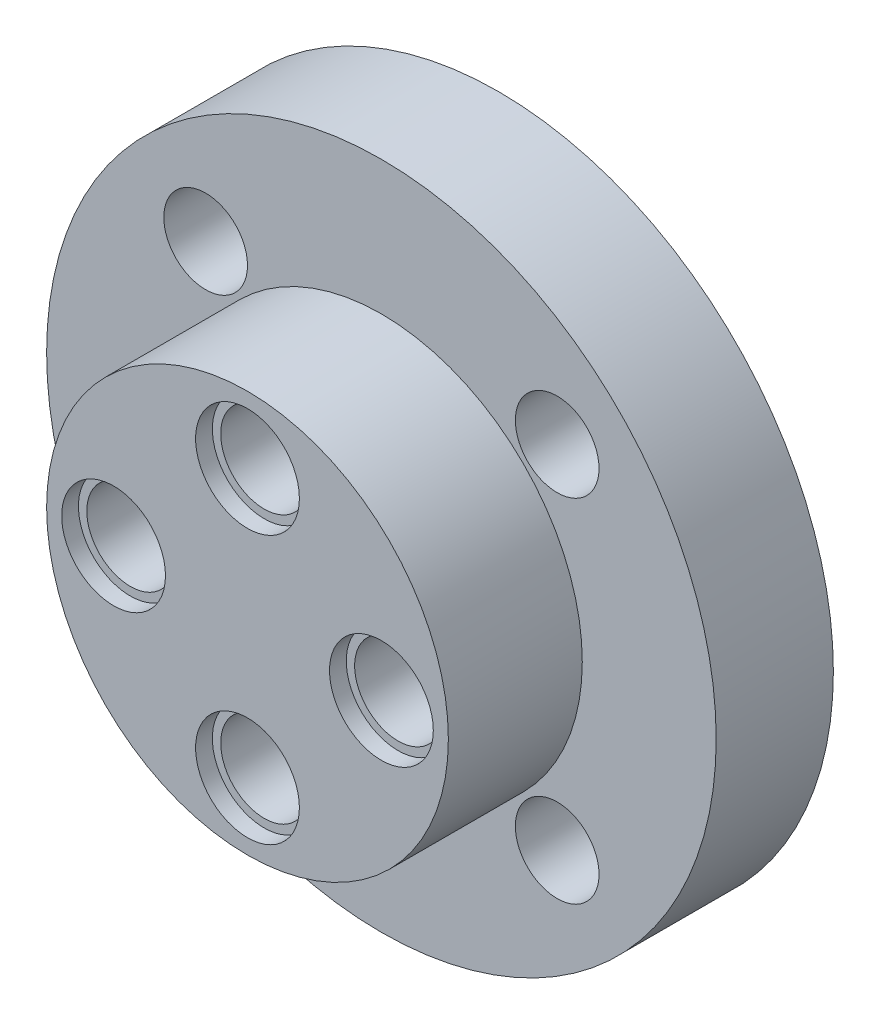
ISO-10303-21;
HEADER;
FILE_DESCRIPTION(('STEP AP214'),'2;1');
FILE_NAME('part.step','',(''),(''),'','','');
FILE_SCHEMA(('AUTOMOTIVE_DESIGN { 1 0 10303 214 1 1 1 1 }'));
ENDSEC;
DATA;
#1=APPLICATION_CONTEXT('core data for automotive mechanical design processes');
#2=APPLICATION_PROTOCOL_DEFINITION('international standard','automotive_design',2000,#1);
#3=PRODUCT_CONTEXT('',#1,'mechanical');
#4=PRODUCT('Part','Part','',(#3));
#5=PRODUCT_RELATED_PRODUCT_CATEGORY('part','',(#4));
#6=PRODUCT_DEFINITION_FORMATION('','',#4);
#7=PRODUCT_DEFINITION_CONTEXT('part definition',#1,'design');
#8=PRODUCT_DEFINITION('design','',#6,#7);
#9=PRODUCT_DEFINITION_SHAPE('','',#8);
#10=(LENGTH_UNIT() NAMED_UNIT(*) SI_UNIT(.MILLI.,.METRE.));
#11=(NAMED_UNIT(*) PLANE_ANGLE_UNIT() SI_UNIT($,.RADIAN.));
#12=(NAMED_UNIT(*) SI_UNIT($,.STERADIAN.) SOLID_ANGLE_UNIT());
#13=UNCERTAINTY_MEASURE_WITH_UNIT(LENGTH_MEASURE(1.E-05),#10,'distance_accuracy_value','');
#14=(GEOMETRIC_REPRESENTATION_CONTEXT(3) GLOBAL_UNCERTAINTY_ASSIGNED_CONTEXT((#13)) GLOBAL_UNIT_ASSIGNED_CONTEXT((#10,
#11,#12)) REPRESENTATION_CONTEXT('',''));
#15=CARTESIAN_POINT('',(0.,0.,0.));
#16=DIRECTION('',(0.,0.,1.));
#17=DIRECTION('',(1.,0.,0.));
#18=AXIS2_PLACEMENT_3D('',#15,#16,#17);
#19=CARTESIAN_POINT('',(0.,0.,7.));
#20=DIRECTION('',(0.,0.,1.));
#21=DIRECTION('',(1.,0.,0.));
#22=AXIS2_PLACEMENT_3D('',#19,#20,#21);
#23=PLANE('',#22);
#24=CARTESIAN_POINT('',(0.,0.,7.));
#25=DIRECTION('',(0.,0.,1.));
#26=DIRECTION('',(1.,0.,0.));
#27=AXIS2_PLACEMENT_3D('',#24,#25,#26);
#28=CIRCLE('',#27,12.);
#29=CARTESIAN_POINT('',(12.,0.,7.));
#30=VERTEX_POINT('',#29);
#31=EDGE_CURVE('E93',#30,#30,#28,.T.);
#32=ORIENTED_EDGE('',*,*,#31,.F.);
#33=EDGE_LOOP('',(#32));
#34=FACE_BOUND('',#33,.T.);
#35=CARTESIAN_POINT('',(-10.5,-10.5,7.));
#36=DIRECTION('',(0.,0.,1.));
#37=DIRECTION('',(1.,0.,0.));
#38=AXIS2_PLACEMENT_3D('',#35,#36,#37);
#39=CIRCLE('',#38,2.5);
#40=CARTESIAN_POINT('',(-8.,-10.5,7.));
#41=VERTEX_POINT('',#40);
#42=EDGE_CURVE('E112',#41,#41,#39,.T.);
#43=ORIENTED_EDGE('',*,*,#42,.F.);
#44=EDGE_LOOP('',(#43));
#45=FACE_BOUND('',#44,.T.);
#46=CARTESIAN_POINT('',(10.5,10.5,7.));
#47=DIRECTION('',(0.,0.,1.));
#48=DIRECTION('',(1.,0.,0.));
#49=AXIS2_PLACEMENT_3D('',#46,#47,#48);
#50=CIRCLE('',#49,2.5);
#51=CARTESIAN_POINT('',(13.,10.5,7.));
#52=VERTEX_POINT('',#51);
#53=EDGE_CURVE('E76',#52,#52,#50,.T.);
#54=ORIENTED_EDGE('',*,*,#53,.F.);
#55=EDGE_LOOP('',(#54));
#56=FACE_BOUND('',#55,.T.);
#57=CARTESIAN_POINT('',(0.,0.,7.));
#58=DIRECTION('',(0.,0.,1.));
#59=DIRECTION('',(1.,0.,0.));
#60=AXIS2_PLACEMENT_3D('',#57,#58,#59);
#61=CIRCLE('',#60,20.);
#62=CARTESIAN_POINT('',(20.,0.,7.));
#63=VERTEX_POINT('',#62);
#64=EDGE_CURVE('E11',#63,#63,#61,.T.);
#65=ORIENTED_EDGE('',*,*,#64,.T.);
#66=EDGE_LOOP('',(#65));
#67=FACE_BOUND('',#66,.T.);
#68=CARTESIAN_POINT('',(10.5,-10.5,7.));
#69=DIRECTION('',(0.,0.,1.));
#70=DIRECTION('',(1.,0.,0.));
#71=AXIS2_PLACEMENT_3D('',#68,#69,#70);
#72=CIRCLE('',#71,2.5);
#73=CARTESIAN_POINT('',(13.,-10.5,7.));
#74=VERTEX_POINT('',#73);
#75=EDGE_CURVE('E118',#74,#74,#72,.T.);
#76=ORIENTED_EDGE('',*,*,#75,.F.);
#77=EDGE_LOOP('',(#76));
#78=FACE_BOUND('',#77,.T.);
#79=CARTESIAN_POINT('',(-10.5,10.5,7.));
#80=DIRECTION('',(0.,0.,1.));
#81=DIRECTION('',(1.,0.,0.));
#82=AXIS2_PLACEMENT_3D('',#79,#80,#81);
#83=CIRCLE('',#82,2.5);
#84=CARTESIAN_POINT('',(-8.,10.5,7.));
#85=VERTEX_POINT('',#84);
#86=EDGE_CURVE('E106',#85,#85,#83,.T.);
#87=ORIENTED_EDGE('',*,*,#86,.F.);
#88=EDGE_LOOP('',(#87));
#89=FACE_BOUND('',#88,.T.);
#90=ADVANCED_FACE('F63',(#34,#45,#56,#67,#78,#89),#23,.T.);
#91=CARTESIAN_POINT('',(0.,0.,0.));
#92=DIRECTION('',(0.,0.,1.));
#93=DIRECTION('',(1.,0.,0.));
#94=AXIS2_PLACEMENT_3D('',#91,#92,#93);
#95=PLANE('',#94);
#96=CARTESIAN_POINT('',(0.,0.,0.));
#97=DIRECTION('',(0.,0.,1.));
#98=DIRECTION('',(1.,0.,0.));
#99=AXIS2_PLACEMENT_3D('',#96,#97,#98);
#100=CIRCLE('',#99,20.);
#101=CARTESIAN_POINT('',(20.,0.,0.));
#102=VERTEX_POINT('',#101);
#103=EDGE_CURVE('E71',#102,#102,#100,.T.);
#104=ORIENTED_EDGE('',*,*,#103,.F.);
#105=EDGE_LOOP('',(#104));
#106=FACE_BOUND('',#105,.T.);
#107=CARTESIAN_POINT('',(10.5,10.5,0.));
#108=DIRECTION('',(0.,0.,1.));
#109=DIRECTION('',(1.,0.,0.));
#110=AXIS2_PLACEMENT_3D('',#107,#108,#109);
#111=CIRCLE('',#110,2.5);
#112=CARTESIAN_POINT('',(13.,10.5,0.));
#113=VERTEX_POINT('',#112);
#114=EDGE_CURVE('E79',#113,#113,#111,.T.);
#115=ORIENTED_EDGE('',*,*,#114,.T.);
#116=EDGE_LOOP('',(#115));
#117=FACE_BOUND('',#116,.T.);
#118=CARTESIAN_POINT('',(10.5,-10.5,0.));
#119=DIRECTION('',(0.,0.,1.));
#120=DIRECTION('',(1.,0.,0.));
#121=AXIS2_PLACEMENT_3D('',#118,#119,#120);
#122=CIRCLE('',#121,2.5);
#123=CARTESIAN_POINT('',(13.,-10.5,0.));
#124=VERTEX_POINT('',#123);
#125=EDGE_CURVE('E115',#124,#124,#122,.T.);
#126=ORIENTED_EDGE('',*,*,#125,.T.);
#127=EDGE_LOOP('',(#126));
#128=FACE_BOUND('',#127,.T.);
#129=CARTESIAN_POINT('',(-10.5,-10.5,0.));
#130=DIRECTION('',(0.,0.,1.));
#131=DIRECTION('',(1.,0.,0.));
#132=AXIS2_PLACEMENT_3D('',#129,#130,#131);
#133=CIRCLE('',#132,2.5);
#134=CARTESIAN_POINT('',(-8.,-10.5,0.));
#135=VERTEX_POINT('',#134);
#136=EDGE_CURVE('E109',#135,#135,#133,.T.);
#137=ORIENTED_EDGE('',*,*,#136,.T.);
#138=EDGE_LOOP('',(#137));
#139=FACE_BOUND('',#138,.T.);
#140=CARTESIAN_POINT('',(-10.5,10.5,0.));
#141=DIRECTION('',(0.,0.,1.));
#142=DIRECTION('',(1.,0.,0.));
#143=AXIS2_PLACEMENT_3D('',#140,#141,#142);
#144=CIRCLE('',#143,2.5);
#145=CARTESIAN_POINT('',(-8.,10.5,0.));
#146=VERTEX_POINT('',#145);
#147=EDGE_CURVE('E102',#146,#146,#144,.T.);
#148=ORIENTED_EDGE('',*,*,#147,.T.);
#149=EDGE_LOOP('',(#148));
#150=FACE_BOUND('',#149,.T.);
#151=ADVANCED_FACE('F128',(#106,#117,#128,#139,#150),#95,.F.);
#152=CARTESIAN_POINT('',(0.,0.,7.));
#153=DIRECTION('',(0.,0.,-1.));
#154=DIRECTION('',(-1.,0.,0.));
#155=AXIS2_PLACEMENT_3D('',#152,#153,#154);
#156=CYLINDRICAL_SURFACE('',#155,20.);
#157=ORIENTED_EDGE('',*,*,#64,.F.);
#158=EDGE_LOOP('',(#157));
#159=FACE_BOUND('',#158,.T.);
#160=ORIENTED_EDGE('',*,*,#103,.T.);
#161=EDGE_LOOP('',(#160));
#162=FACE_BOUND('',#161,.T.);
#163=ADVANCED_FACE('F65',(#159,#162),#156,.T.);
#164=CARTESIAN_POINT('',(10.5,10.5,7.));
#165=DIRECTION('',(0.,0.,-1.));
#166=DIRECTION('',(-1.,0.,0.));
#167=AXIS2_PLACEMENT_3D('',#164,#165,#166);
#168=CYLINDRICAL_SURFACE('',#167,2.5);
#169=ORIENTED_EDGE('',*,*,#53,.T.);
#170=EDGE_LOOP('',(#169));
#171=FACE_BOUND('',#170,.T.);
#172=ORIENTED_EDGE('',*,*,#114,.F.);
#173=EDGE_LOOP('',(#172));
#174=FACE_BOUND('',#173,.T.);
#175=ADVANCED_FACE('F131',(#171,#174),#168,.F.);
#176=CARTESIAN_POINT('',(10.5,-10.5,7.));
#177=DIRECTION('',(0.,0.,-1.));
#178=DIRECTION('',(-1.,0.,0.));
#179=AXIS2_PLACEMENT_3D('',#176,#177,#178);
#180=CYLINDRICAL_SURFACE('',#179,2.5);
#181=ORIENTED_EDGE('',*,*,#75,.T.);
#182=EDGE_LOOP('',(#181));
#183=FACE_BOUND('',#182,.T.);
#184=ORIENTED_EDGE('',*,*,#125,.F.);
#185=EDGE_LOOP('',(#184));
#186=FACE_BOUND('',#185,.T.);
#187=ADVANCED_FACE('F133',(#183,#186),#180,.F.);
#188=CARTESIAN_POINT('',(-10.5,-10.5,7.));
#189=DIRECTION('',(0.,0.,-1.));
#190=DIRECTION('',(-1.,0.,0.));
#191=AXIS2_PLACEMENT_3D('',#188,#189,#190);
#192=CYLINDRICAL_SURFACE('',#191,2.5);
#193=ORIENTED_EDGE('',*,*,#42,.T.);
#194=EDGE_LOOP('',(#193));
#195=FACE_BOUND('',#194,.T.);
#196=ORIENTED_EDGE('',*,*,#136,.F.);
#197=EDGE_LOOP('',(#196));
#198=FACE_BOUND('',#197,.T.);
#199=ADVANCED_FACE('F139',(#195,#198),#192,.F.);
#200=CARTESIAN_POINT('',(-10.5,10.5,7.));
#201=DIRECTION('',(0.,0.,-1.));
#202=DIRECTION('',(-1.,0.,0.));
#203=AXIS2_PLACEMENT_3D('',#200,#201,#202);
#204=CYLINDRICAL_SURFACE('',#203,2.5);
#205=ORIENTED_EDGE('',*,*,#86,.T.);
#206=EDGE_LOOP('',(#205));
#207=FACE_BOUND('',#206,.T.);
#208=ORIENTED_EDGE('',*,*,#147,.F.);
#209=EDGE_LOOP('',(#208));
#210=FACE_BOUND('',#209,.T.);
#211=ADVANCED_FACE('F160',(#207,#210),#204,.F.);
#212=CARTESIAN_POINT('',(0.,0.,15.));
#213=DIRECTION('',(0.,0.,-1.));
#214=DIRECTION('',(-1.,0.,0.));
#215=AXIS2_PLACEMENT_3D('',#212,#213,#214);
#216=CYLINDRICAL_SURFACE('',#215,12.);
#217=CARTESIAN_POINT('',(0.,0.,15.));
#218=DIRECTION('',(0.,0.,1.));
#219=DIRECTION('',(1.,0.,0.));
#220=AXIS2_PLACEMENT_3D('',#217,#218,#219);
#221=CIRCLE('',#220,12.);
#222=CARTESIAN_POINT('',(12.,0.,15.));
#223=VERTEX_POINT('',#222);
#224=EDGE_CURVE('E97',#223,#223,#221,.T.);
#225=ORIENTED_EDGE('',*,*,#224,.F.);
#226=EDGE_LOOP('',(#225));
#227=FACE_BOUND('',#226,.T.);
#228=ORIENTED_EDGE('',*,*,#31,.T.);
#229=EDGE_LOOP('',(#228));
#230=FACE_BOUND('',#229,.T.);
#231=ADVANCED_FACE('F162',(#227,#230),#216,.T.);
#232=CARTESIAN_POINT('',(0.,0.,15.));
#233=DIRECTION('',(0.,0.,1.));
#234=DIRECTION('',(1.,0.,0.));
#235=AXIS2_PLACEMENT_3D('',#232,#233,#234);
#236=PLANE('',#235);
#237=CARTESIAN_POINT('',(-8.,0.,15.));
#238=DIRECTION('',(0.,0.,1.));
#239=DIRECTION('',(1.,0.,0.));
#240=AXIS2_PLACEMENT_3D('',#237,#238,#239);
#241=CIRCLE('',#240,3.1);
#242=CARTESIAN_POINT('',(-4.9,0.,15.));
#243=VERTEX_POINT('',#242);
#244=EDGE_CURVE('E306',#243,#243,#241,.T.);
#245=ORIENTED_EDGE('',*,*,#244,.F.);
#246=EDGE_LOOP('',(#245));
#247=FACE_BOUND('',#246,.T.);
#248=CARTESIAN_POINT('',(0.,8.,15.));
#249=DIRECTION('',(0.,0.,1.));
#250=DIRECTION('',(1.,0.,0.));
#251=AXIS2_PLACEMENT_3D('',#248,#249,#250);
#252=CIRCLE('',#251,3.1);
#253=CARTESIAN_POINT('',(3.1,8.,15.));
#254=VERTEX_POINT('',#253);
#255=EDGE_CURVE('E309',#254,#254,#252,.T.);
#256=ORIENTED_EDGE('',*,*,#255,.F.);
#257=EDGE_LOOP('',(#256));
#258=FACE_BOUND('',#257,.T.);
#259=CARTESIAN_POINT('',(8.,0.,15.));
#260=DIRECTION('',(0.,0.,1.));
#261=DIRECTION('',(1.,0.,0.));
#262=AXIS2_PLACEMENT_3D('',#259,#260,#261);
#263=CIRCLE('',#262,3.1);
#264=CARTESIAN_POINT('',(11.1,0.,15.));
#265=VERTEX_POINT('',#264);
#266=EDGE_CURVE('E315',#265,#265,#263,.T.);
#267=ORIENTED_EDGE('',*,*,#266,.F.);
#268=EDGE_LOOP('',(#267));
#269=FACE_BOUND('',#268,.T.);
#270=CARTESIAN_POINT('',(0.,-8.,15.));
#271=DIRECTION('',(0.,0.,1.));
#272=DIRECTION('',(1.,0.,0.));
#273=AXIS2_PLACEMENT_3D('',#270,#271,#272);
#274=CIRCLE('',#273,3.1);
#275=CARTESIAN_POINT('',(3.1,-8.,15.));
#276=VERTEX_POINT('',#275);
#277=EDGE_CURVE('E321',#276,#276,#274,.T.);
#278=ORIENTED_EDGE('',*,*,#277,.F.);
#279=EDGE_LOOP('',(#278));
#280=FACE_BOUND('',#279,.T.);
#281=ORIENTED_EDGE('',*,*,#224,.T.);
#282=EDGE_LOOP('',(#281));
#283=FACE_BOUND('',#282,.T.);
#284=ADVANCED_FACE('F169',(#247,#258,#269,#280,#283),#236,.T.);
#285=CARTESIAN_POINT('',(-8.,0.,14.));
#286=DIRECTION('',(0.,0.,1.));
#287=DIRECTION('',(1.,0.,0.));
#288=AXIS2_PLACEMENT_3D('',#285,#286,#287);
#289=PLANE('',#288);
#290=CARTESIAN_POINT('',(-8.,0.,14.));
#291=DIRECTION('',(0.,0.,1.));
#292=DIRECTION('',(1.,0.,0.));
#293=AXIS2_PLACEMENT_3D('',#290,#291,#292);
#294=CIRCLE('',#293,3.1);
#295=CARTESIAN_POINT('',(-4.9,0.,14.));
#296=VERTEX_POINT('',#295);
#297=EDGE_CURVE('E86',#296,#296,#294,.T.);
#298=ORIENTED_EDGE('',*,*,#297,.T.);
#299=EDGE_LOOP('',(#298));
#300=FACE_BOUND('',#299,.T.);
#301=CARTESIAN_POINT('',(-8.,0.,14.));
#302=DIRECTION('',(0.,0.,1.));
#303=DIRECTION('',(1.,0.,0.));
#304=AXIS2_PLACEMENT_3D('',#301,#302,#303);
#305=CIRCLE('',#304,2.6);
#306=CARTESIAN_POINT('',(-5.4,0.,14.));
#307=VERTEX_POINT('',#306);
#308=EDGE_CURVE('E82',#307,#307,#305,.F.);
#309=ORIENTED_EDGE('',*,*,#308,.T.);
#310=EDGE_LOOP('',(#309));
#311=FACE_BOUND('',#310,.T.);
#312=ADVANCED_FACE('F177',(#300,#311),#289,.T.);
#313=CARTESIAN_POINT('',(-8.,0.,14.));
#314=DIRECTION('',(0.,0.,1.));
#315=DIRECTION('',(1.,0.,0.));
#316=AXIS2_PLACEMENT_3D('',#313,#314,#315);
#317=CYLINDRICAL_SURFACE('',#316,3.1);
#318=ORIENTED_EDGE('',*,*,#297,.F.);
#319=EDGE_LOOP('',(#318));
#320=FACE_BOUND('',#319,.T.);
#321=ORIENTED_EDGE('',*,*,#244,.T.);
#322=EDGE_LOOP('',(#321));
#323=FACE_BOUND('',#322,.T.);
#324=ADVANCED_FACE('F216',(#320,#323),#317,.F.);
#325=CARTESIAN_POINT('',(0.,8.,14.));
#326=DIRECTION('',(0.,0.,1.));
#327=DIRECTION('',(1.,0.,0.));
#328=AXIS2_PLACEMENT_3D('',#325,#326,#327);
#329=PLANE('',#328);
#330=CARTESIAN_POINT('',(0.,8.,14.));
#331=DIRECTION('',(0.,0.,1.));
#332=DIRECTION('',(1.,0.,0.));
#333=AXIS2_PLACEMENT_3D('',#330,#331,#332);
#334=CIRCLE('',#333,3.1);
#335=CARTESIAN_POINT('',(3.1,8.,14.));
#336=VERTEX_POINT('',#335);
#337=EDGE_CURVE('E312',#336,#336,#334,.T.);
#338=ORIENTED_EDGE('',*,*,#337,.T.);
#339=EDGE_LOOP('',(#338));
#340=FACE_BOUND('',#339,.T.);
#341=CARTESIAN_POINT('',(0.,8.,14.));
#342=DIRECTION('',(0.,0.,1.));
#343=DIRECTION('',(1.,0.,0.));
#344=AXIS2_PLACEMENT_3D('',#341,#342,#343);
#345=CIRCLE('',#344,2.6);
#346=CARTESIAN_POINT('',(2.6,8.,14.));
#347=VERTEX_POINT('',#346);
#348=EDGE_CURVE('E85',#347,#347,#345,.F.);
#349=ORIENTED_EDGE('',*,*,#348,.T.);
#350=EDGE_LOOP('',(#349));
#351=FACE_BOUND('',#350,.T.);
#352=ADVANCED_FACE('F213',(#340,#351),#329,.T.);
#353=CARTESIAN_POINT('',(0.,8.,14.));
#354=DIRECTION('',(0.,0.,1.));
#355=DIRECTION('',(1.,0.,0.));
#356=AXIS2_PLACEMENT_3D('',#353,#354,#355);
#357=CYLINDRICAL_SURFACE('',#356,3.1);
#358=ORIENTED_EDGE('',*,*,#337,.F.);
#359=EDGE_LOOP('',(#358));
#360=FACE_BOUND('',#359,.T.);
#361=ORIENTED_EDGE('',*,*,#255,.T.);
#362=EDGE_LOOP('',(#361));
#363=FACE_BOUND('',#362,.T.);
#364=ADVANCED_FACE('F208',(#360,#363),#357,.F.);
#365=CARTESIAN_POINT('',(8.,0.,14.));
#366=DIRECTION('',(0.,0.,1.));
#367=DIRECTION('',(1.,0.,0.));
#368=AXIS2_PLACEMENT_3D('',#365,#366,#367);
#369=PLANE('',#368);
#370=CARTESIAN_POINT('',(8.,0.,14.));
#371=DIRECTION('',(0.,0.,1.));
#372=DIRECTION('',(1.,0.,0.));
#373=AXIS2_PLACEMENT_3D('',#370,#371,#372);
#374=CIRCLE('',#373,3.1);
#375=CARTESIAN_POINT('',(11.1,0.,14.));
#376=VERTEX_POINT('',#375);
#377=EDGE_CURVE('E318',#376,#376,#374,.T.);
#378=ORIENTED_EDGE('',*,*,#377,.T.);
#379=EDGE_LOOP('',(#378));
#380=FACE_BOUND('',#379,.T.);
#381=CARTESIAN_POINT('',(8.,0.,14.));
#382=DIRECTION('',(0.,0.,1.));
#383=DIRECTION('',(1.,0.,0.));
#384=AXIS2_PLACEMENT_3D('',#381,#382,#383);
#385=CIRCLE('',#384,2.6);
#386=CARTESIAN_POINT('',(10.6,0.,14.));
#387=VERTEX_POINT('',#386);
#388=EDGE_CURVE('E88',#387,#387,#385,.F.);
#389=ORIENTED_EDGE('',*,*,#388,.T.);
#390=EDGE_LOOP('',(#389));
#391=FACE_BOUND('',#390,.T.);
#392=ADVANCED_FACE('F205',(#380,#391),#369,.T.);
#393=CARTESIAN_POINT('',(8.,0.,14.));
#394=DIRECTION('',(0.,0.,1.));
#395=DIRECTION('',(1.,0.,0.));
#396=AXIS2_PLACEMENT_3D('',#393,#394,#395);
#397=CYLINDRICAL_SURFACE('',#396,3.1);
#398=ORIENTED_EDGE('',*,*,#377,.F.);
#399=EDGE_LOOP('',(#398));
#400=FACE_BOUND('',#399,.T.);
#401=ORIENTED_EDGE('',*,*,#266,.T.);
#402=EDGE_LOOP('',(#401));
#403=FACE_BOUND('',#402,.T.);
#404=ADVANCED_FACE('F200',(#400,#403),#397,.F.);
#405=CARTESIAN_POINT('',(0.,-8.,14.));
#406=DIRECTION('',(0.,0.,1.));
#407=DIRECTION('',(1.,0.,0.));
#408=AXIS2_PLACEMENT_3D('',#405,#406,#407);
#409=PLANE('',#408);
#410=CARTESIAN_POINT('',(0.,-8.,14.));
#411=DIRECTION('',(0.,0.,1.));
#412=DIRECTION('',(1.,0.,0.));
#413=AXIS2_PLACEMENT_3D('',#410,#411,#412);
#414=CIRCLE('',#413,3.1);
#415=CARTESIAN_POINT('',(3.1,-8.,14.));
#416=VERTEX_POINT('',#415);
#417=EDGE_CURVE('E324',#416,#416,#414,.T.);
#418=ORIENTED_EDGE('',*,*,#417,.T.);
#419=EDGE_LOOP('',(#418));
#420=FACE_BOUND('',#419,.T.);
#421=CARTESIAN_POINT('',(0.,-8.,14.));
#422=DIRECTION('',(0.,0.,1.));
#423=DIRECTION('',(1.,0.,0.));
#424=AXIS2_PLACEMENT_3D('',#421,#422,#423);
#425=CIRCLE('',#424,2.6);
#426=CARTESIAN_POINT('',(2.6,-8.,14.));
#427=VERTEX_POINT('',#426);
#428=EDGE_CURVE('E67',#427,#427,#425,.F.);
#429=ORIENTED_EDGE('',*,*,#428,.T.);
#430=EDGE_LOOP('',(#429));
#431=FACE_BOUND('',#430,.T.);
#432=ADVANCED_FACE('F197',(#420,#431),#409,.T.);
#433=CARTESIAN_POINT('',(0.,-8.,14.));
#434=DIRECTION('',(0.,0.,1.));
#435=DIRECTION('',(1.,0.,0.));
#436=AXIS2_PLACEMENT_3D('',#433,#434,#435);
#437=CYLINDRICAL_SURFACE('',#436,3.1);
#438=ORIENTED_EDGE('',*,*,#417,.F.);
#439=EDGE_LOOP('',(#438));
#440=FACE_BOUND('',#439,.T.);
#441=ORIENTED_EDGE('',*,*,#277,.T.);
#442=EDGE_LOOP('',(#441));
#443=FACE_BOUND('',#442,.T.);
#444=ADVANCED_FACE('F195',(#440,#443),#437,.F.);
#445=CARTESIAN_POINT('',(-8.,0.,8.));
#446=DIRECTION('',(0.,0.,1.));
#447=DIRECTION('',(1.,0.,0.));
#448=AXIS2_PLACEMENT_3D('',#445,#446,#447);
#449=CYLINDRICAL_SURFACE('',#448,2.6);
#450=CARTESIAN_POINT('',(-8.,0.,8.));
#451=DIRECTION('',(0.,0.,1.));
#452=DIRECTION('',(1.,0.,0.));
#453=AXIS2_PLACEMENT_3D('',#450,#451,#452);
#454=CIRCLE('',#453,2.6);
#455=CARTESIAN_POINT('',(-5.4,0.,8.));
#456=VERTEX_POINT('',#455);
#457=EDGE_CURVE('E327',#456,#456,#454,.T.);
#458=ORIENTED_EDGE('',*,*,#457,.F.);
#459=EDGE_LOOP('',(#458));
#460=FACE_BOUND('',#459,.T.);
#461=ORIENTED_EDGE('',*,*,#308,.F.);
#462=EDGE_LOOP('',(#461));
#463=FACE_BOUND('',#462,.T.);
#464=ADVANCED_FACE('F191',(#460,#463),#449,.F.);
#465=CARTESIAN_POINT('',(0.,8.,8.));
#466=DIRECTION('',(0.,0.,1.));
#467=DIRECTION('',(1.,0.,0.));
#468=AXIS2_PLACEMENT_3D('',#465,#466,#467);
#469=CYLINDRICAL_SURFACE('',#468,2.6);
#470=CARTESIAN_POINT('',(0.,8.,8.));
#471=DIRECTION('',(0.,0.,1.));
#472=DIRECTION('',(1.,0.,0.));
#473=AXIS2_PLACEMENT_3D('',#470,#471,#472);
#474=CIRCLE('',#473,2.6);
#475=CARTESIAN_POINT('',(2.6,8.,8.));
#476=VERTEX_POINT('',#475);
#477=EDGE_CURVE('E330',#476,#476,#474,.T.);
#478=ORIENTED_EDGE('',*,*,#477,.F.);
#479=EDGE_LOOP('',(#478));
#480=FACE_BOUND('',#479,.T.);
#481=ORIENTED_EDGE('',*,*,#348,.F.);
#482=EDGE_LOOP('',(#481));
#483=FACE_BOUND('',#482,.T.);
#484=ADVANCED_FACE('F187',(#480,#483),#469,.F.);
#485=CARTESIAN_POINT('',(8.,0.,8.));
#486=DIRECTION('',(0.,0.,1.));
#487=DIRECTION('',(1.,0.,0.));
#488=AXIS2_PLACEMENT_3D('',#485,#486,#487);
#489=CYLINDRICAL_SURFACE('',#488,2.6);
#490=CARTESIAN_POINT('',(8.,0.,8.));
#491=DIRECTION('',(0.,0.,1.));
#492=DIRECTION('',(1.,0.,0.));
#493=AXIS2_PLACEMENT_3D('',#490,#491,#492);
#494=CIRCLE('',#493,2.6);
#495=CARTESIAN_POINT('',(10.6,0.,8.));
#496=VERTEX_POINT('',#495);
#497=EDGE_CURVE('E282',#496,#496,#494,.T.);
#498=ORIENTED_EDGE('',*,*,#497,.F.);
#499=EDGE_LOOP('',(#498));
#500=FACE_BOUND('',#499,.T.);
#501=ORIENTED_EDGE('',*,*,#388,.F.);
#502=EDGE_LOOP('',(#501));
#503=FACE_BOUND('',#502,.T.);
#504=ADVANCED_FACE('F183',(#500,#503),#489,.F.);
#505=CARTESIAN_POINT('',(0.,-8.,8.));
#506=DIRECTION('',(0.,0.,1.));
#507=DIRECTION('',(1.,0.,0.));
#508=AXIS2_PLACEMENT_3D('',#505,#506,#507);
#509=CYLINDRICAL_SURFACE('',#508,2.6);
#510=CARTESIAN_POINT('',(0.,-8.,8.));
#511=DIRECTION('',(0.,0.,1.));
#512=DIRECTION('',(1.,0.,0.));
#513=AXIS2_PLACEMENT_3D('',#510,#511,#512);
#514=CIRCLE('',#513,2.6);
#515=CARTESIAN_POINT('',(2.6,-8.,8.));
#516=VERTEX_POINT('',#515);
#517=EDGE_CURVE('E278',#516,#516,#514,.T.);
#518=ORIENTED_EDGE('',*,*,#517,.F.);
#519=EDGE_LOOP('',(#518));
#520=FACE_BOUND('',#519,.T.);
#521=ORIENTED_EDGE('',*,*,#428,.F.);
#522=EDGE_LOOP('',(#521));
#523=FACE_BOUND('',#522,.T.);
#524=ADVANCED_FACE('F179',(#520,#523),#509,.F.);
#525=CARTESIAN_POINT('',(0.,-8.,7.));
#526=DIRECTION('',(0.,0.,1.));
#527=DIRECTION('',(1.,0.,0.));
#528=AXIS2_PLACEMENT_3D('',#525,#526,#527);
#529=CYLINDRICAL_SURFACE('',#528,3.1);
#530=CARTESIAN_POINT('',(0.,-8.,7.));
#531=DIRECTION('',(0.,0.,1.));
#532=DIRECTION('',(1.,0.,0.));
#533=AXIS2_PLACEMENT_3D('',#530,#531,#532);
#534=CIRCLE('',#533,3.1);
#535=CARTESIAN_POINT('',(3.1,-8.,7.));
#536=VERTEX_POINT('',#535);
#537=EDGE_CURVE('E301',#536,#536,#534,.T.);
#538=ORIENTED_EDGE('',*,*,#537,.F.);
#539=EDGE_LOOP('',(#538));
#540=FACE_BOUND('',#539,.T.);
#541=CARTESIAN_POINT('',(0.,-8.,8.));
#542=DIRECTION('',(0.,0.,1.));
#543=DIRECTION('',(1.,0.,0.));
#544=AXIS2_PLACEMENT_3D('',#541,#542,#543);
#545=CIRCLE('',#544,3.1);
#546=CARTESIAN_POINT('',(3.1,-8.,8.));
#547=VERTEX_POINT('',#546);
#548=EDGE_CURVE('E298',#547,#547,#545,.T.);
#549=ORIENTED_EDGE('',*,*,#548,.T.);
#550=EDGE_LOOP('',(#549));
#551=FACE_BOUND('',#550,.T.);
#552=ADVANCED_FACE('F182',(#540,#551),#529,.F.);
#553=CARTESIAN_POINT('',(0.,-8.,7.));
#554=DIRECTION('',(0.,0.,1.));
#555=DIRECTION('',(1.,0.,0.));
#556=AXIS2_PLACEMENT_3D('',#553,#554,#555);
#557=PLANE('',#556);
#558=ORIENTED_EDGE('',*,*,#537,.T.);
#559=EDGE_LOOP('',(#558));
#560=FACE_BOUND('',#559,.T.);
#561=ADVANCED_FACE('F227',(#560),#557,.T.);
#562=CARTESIAN_POINT('',(0.,-8.,8.));
#563=DIRECTION('',(0.,0.,1.));
#564=DIRECTION('',(1.,0.,0.));
#565=AXIS2_PLACEMENT_3D('',#562,#563,#564);
#566=PLANE('',#565);
#567=ORIENTED_EDGE('',*,*,#517,.T.);
#568=EDGE_LOOP('',(#567));
#569=FACE_BOUND('',#568,.T.);
#570=ORIENTED_EDGE('',*,*,#548,.F.);
#571=EDGE_LOOP('',(#570));
#572=FACE_BOUND('',#571,.T.);
#573=ADVANCED_FACE('F230',(#569,#572),#566,.F.);
#574=CARTESIAN_POINT('',(8.,0.,7.));
#575=DIRECTION('',(0.,0.,1.));
#576=DIRECTION('',(1.,0.,0.));
#577=AXIS2_PLACEMENT_3D('',#574,#575,#576);
#578=CYLINDRICAL_SURFACE('',#577,3.1);
#579=CARTESIAN_POINT('',(8.,0.,7.));
#580=DIRECTION('',(0.,0.,1.));
#581=DIRECTION('',(1.,0.,0.));
#582=AXIS2_PLACEMENT_3D('',#579,#580,#581);
#583=CIRCLE('',#582,3.1);
#584=CARTESIAN_POINT('',(11.1,0.,7.));
#585=VERTEX_POINT('',#584);
#586=EDGE_CURVE('E277',#585,#585,#583,.T.);
#587=ORIENTED_EDGE('',*,*,#586,.F.);
#588=EDGE_LOOP('',(#587));
#589=FACE_BOUND('',#588,.T.);
#590=CARTESIAN_POINT('',(8.,0.,8.));
#591=DIRECTION('',(0.,0.,1.));
#592=DIRECTION('',(1.,0.,0.));
#593=AXIS2_PLACEMENT_3D('',#590,#591,#592);
#594=CIRCLE('',#593,3.1);
#595=CARTESIAN_POINT('',(11.1,0.,8.));
#596=VERTEX_POINT('',#595);
#597=EDGE_CURVE('E279',#596,#596,#594,.T.);
#598=ORIENTED_EDGE('',*,*,#597,.T.);
#599=EDGE_LOOP('',(#598));
#600=FACE_BOUND('',#599,.T.);
#601=ADVANCED_FACE('F234',(#589,#600),#578,.F.);
#602=CARTESIAN_POINT('',(8.,0.,7.));
#603=DIRECTION('',(0.,0.,1.));
#604=DIRECTION('',(1.,0.,0.));
#605=AXIS2_PLACEMENT_3D('',#602,#603,#604);
#606=PLANE('',#605);
#607=ORIENTED_EDGE('',*,*,#586,.T.);
#608=EDGE_LOOP('',(#607));
#609=FACE_BOUND('',#608,.T.);
#610=ADVANCED_FACE('F266',(#609),#606,.T.);
#611=CARTESIAN_POINT('',(8.,0.,8.));
#612=DIRECTION('',(0.,0.,1.));
#613=DIRECTION('',(1.,0.,0.));
#614=AXIS2_PLACEMENT_3D('',#611,#612,#613);
#615=PLANE('',#614);
#616=ORIENTED_EDGE('',*,*,#497,.T.);
#617=EDGE_LOOP('',(#616));
#618=FACE_BOUND('',#617,.T.);
#619=ORIENTED_EDGE('',*,*,#597,.F.);
#620=EDGE_LOOP('',(#619));
#621=FACE_BOUND('',#620,.T.);
#622=ADVANCED_FACE('F262',(#618,#621),#615,.F.);
#623=CARTESIAN_POINT('',(0.,8.,7.));
#624=DIRECTION('',(0.,0.,1.));
#625=DIRECTION('',(1.,0.,0.));
#626=AXIS2_PLACEMENT_3D('',#623,#624,#625);
#627=CYLINDRICAL_SURFACE('',#626,3.1);
#628=CARTESIAN_POINT('',(0.,8.,7.));
#629=DIRECTION('',(0.,0.,1.));
#630=DIRECTION('',(1.,0.,0.));
#631=AXIS2_PLACEMENT_3D('',#628,#629,#630);
#632=CIRCLE('',#631,3.1);
#633=CARTESIAN_POINT('',(3.1,8.,7.));
#634=VERTEX_POINT('',#633);
#635=EDGE_CURVE('E289',#634,#634,#632,.T.);
#636=ORIENTED_EDGE('',*,*,#635,.F.);
#637=EDGE_LOOP('',(#636));
#638=FACE_BOUND('',#637,.T.);
#639=CARTESIAN_POINT('',(0.,8.,8.));
#640=DIRECTION('',(0.,0.,1.));
#641=DIRECTION('',(1.,0.,0.));
#642=AXIS2_PLACEMENT_3D('',#639,#640,#641);
#643=CIRCLE('',#642,3.1);
#644=CARTESIAN_POINT('',(3.1,8.,8.));
#645=VERTEX_POINT('',#644);
#646=EDGE_CURVE('E284',#645,#645,#643,.T.);
#647=ORIENTED_EDGE('',*,*,#646,.T.);
#648=EDGE_LOOP('',(#647));
#649=FACE_BOUND('',#648,.T.);
#650=ADVANCED_FACE('F255',(#638,#649),#627,.F.);
#651=CARTESIAN_POINT('',(0.,8.,7.));
#652=DIRECTION('',(0.,0.,1.));
#653=DIRECTION('',(1.,0.,0.));
#654=AXIS2_PLACEMENT_3D('',#651,#652,#653);
#655=PLANE('',#654);
#656=ORIENTED_EDGE('',*,*,#635,.T.);
#657=EDGE_LOOP('',(#656));
#658=FACE_BOUND('',#657,.T.);
#659=ADVANCED_FACE('F252',(#658),#655,.T.);
#660=CARTESIAN_POINT('',(0.,8.,8.));
#661=DIRECTION('',(0.,0.,1.));
#662=DIRECTION('',(1.,0.,0.));
#663=AXIS2_PLACEMENT_3D('',#660,#661,#662);
#664=PLANE('',#663);
#665=ORIENTED_EDGE('',*,*,#477,.T.);
#666=EDGE_LOOP('',(#665));
#667=FACE_BOUND('',#666,.T.);
#668=ORIENTED_EDGE('',*,*,#646,.F.);
#669=EDGE_LOOP('',(#668));
#670=FACE_BOUND('',#669,.T.);
#671=ADVANCED_FACE('F250',(#667,#670),#664,.F.);
#672=CARTESIAN_POINT('',(-8.,0.,7.));
#673=DIRECTION('',(0.,0.,1.));
#674=DIRECTION('',(1.,0.,0.));
#675=AXIS2_PLACEMENT_3D('',#672,#673,#674);
#676=CYLINDRICAL_SURFACE('',#675,3.1);
#677=CARTESIAN_POINT('',(-8.,0.,7.));
#678=DIRECTION('',(0.,0.,1.));
#679=DIRECTION('',(1.,0.,0.));
#680=AXIS2_PLACEMENT_3D('',#677,#678,#679);
#681=CIRCLE('',#680,3.1);
#682=CARTESIAN_POINT('',(-4.9,0.,7.));
#683=VERTEX_POINT('',#682);
#684=EDGE_CURVE('E295',#683,#683,#681,.T.);
#685=ORIENTED_EDGE('',*,*,#684,.F.);
#686=EDGE_LOOP('',(#685));
#687=FACE_BOUND('',#686,.T.);
#688=CARTESIAN_POINT('',(-8.,0.,8.));
#689=DIRECTION('',(0.,0.,1.));
#690=DIRECTION('',(1.,0.,0.));
#691=AXIS2_PLACEMENT_3D('',#688,#689,#690);
#692=CIRCLE('',#691,3.1);
#693=CARTESIAN_POINT('',(-4.9,0.,8.));
#694=VERTEX_POINT('',#693);
#695=EDGE_CURVE('E292',#694,#694,#692,.T.);
#696=ORIENTED_EDGE('',*,*,#695,.T.);
#697=EDGE_LOOP('',(#696));
#698=FACE_BOUND('',#697,.T.);
#699=ADVANCED_FACE('F243',(#687,#698),#676,.F.);
#700=CARTESIAN_POINT('',(-8.,0.,7.));
#701=DIRECTION('',(0.,0.,1.));
#702=DIRECTION('',(1.,0.,0.));
#703=AXIS2_PLACEMENT_3D('',#700,#701,#702);
#704=PLANE('',#703);
#705=ORIENTED_EDGE('',*,*,#684,.T.);
#706=EDGE_LOOP('',(#705));
#707=FACE_BOUND('',#706,.T.);
#708=ADVANCED_FACE('F239',(#707),#704,.T.);
#709=CARTESIAN_POINT('',(-8.,0.,8.));
#710=DIRECTION('',(0.,0.,1.));
#711=DIRECTION('',(1.,0.,0.));
#712=AXIS2_PLACEMENT_3D('',#709,#710,#711);
#713=PLANE('',#712);
#714=ORIENTED_EDGE('',*,*,#457,.T.);
#715=EDGE_LOOP('',(#714));
#716=FACE_BOUND('',#715,.T.);
#717=ORIENTED_EDGE('',*,*,#695,.F.);
#718=EDGE_LOOP('',(#717));
#719=FACE_BOUND('',#718,.T.);
#720=ADVANCED_FACE('F242',(#716,#719),#713,.F.);
#721=CLOSED_SHELL('',(#90,#151,#163,#175,#187,#199,#211,#231,#284,#312,#324,#352,#364,#392,#404,
#432,#444,#464,#484,#504,#524,#552,#561,#573,#601,#610,#622,#650,#659,#671,#699,#708,#720));
#722=MANIFOLD_SOLID_BREP('B2',#721);
#723=ADVANCED_BREP_SHAPE_REPRESENTATION('',(#18,#722),#14);
#724=SHAPE_DEFINITION_REPRESENTATION(#9,#723);
ENDSEC;
END-ISO-10303-21;
